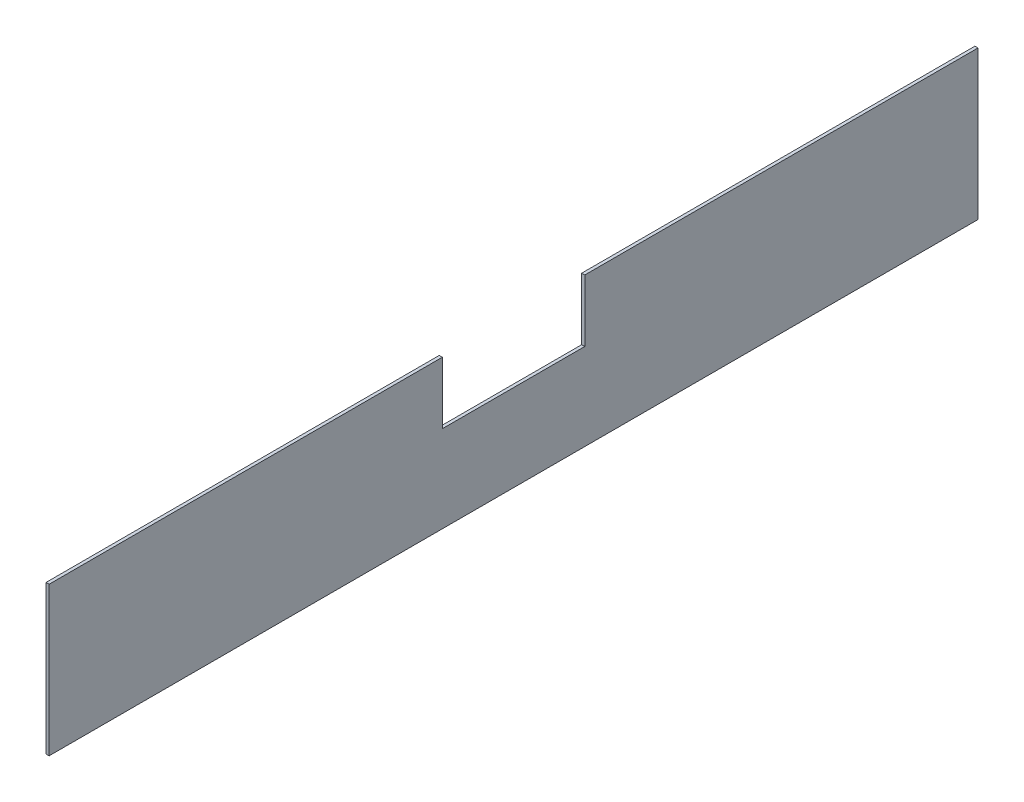
ISO-10303-21;
HEADER;
FILE_DESCRIPTION(('STEP AP214'),'2;1');
FILE_NAME('part.step','',(''),(''),'','','');
FILE_SCHEMA(('AUTOMOTIVE_DESIGN { 1 0 10303 214 1 1 1 1 }'));
ENDSEC;
DATA;
#1=APPLICATION_CONTEXT('core data for automotive mechanical design processes');
#2=APPLICATION_PROTOCOL_DEFINITION('international standard','automotive_design',2000,#1);
#3=PRODUCT_CONTEXT('',#1,'mechanical');
#4=PRODUCT('Part','Part','',(#3));
#5=PRODUCT_RELATED_PRODUCT_CATEGORY('part','',(#4));
#6=PRODUCT_DEFINITION_FORMATION('','',#4);
#7=PRODUCT_DEFINITION_CONTEXT('part definition',#1,'design');
#8=PRODUCT_DEFINITION('design','',#6,#7);
#9=PRODUCT_DEFINITION_SHAPE('','',#8);
#10=(LENGTH_UNIT() NAMED_UNIT(*) SI_UNIT(.MILLI.,.METRE.));
#11=(NAMED_UNIT(*) PLANE_ANGLE_UNIT() SI_UNIT($,.RADIAN.));
#12=(NAMED_UNIT(*) SI_UNIT($,.STERADIAN.) SOLID_ANGLE_UNIT());
#13=UNCERTAINTY_MEASURE_WITH_UNIT(LENGTH_MEASURE(1.E-05),#10,'distance_accuracy_value','');
#14=(GEOMETRIC_REPRESENTATION_CONTEXT(3) GLOBAL_UNCERTAINTY_ASSIGNED_CONTEXT((#13)) GLOBAL_UNIT_ASSIGNED_CONTEXT((#10,
#11,#12)) REPRESENTATION_CONTEXT('',''));
#15=CARTESIAN_POINT('',(0.,0.,0.));
#16=DIRECTION('',(0.,0.,1.));
#17=DIRECTION('',(1.,0.,0.));
#18=AXIS2_PLACEMENT_3D('',#15,#16,#17);
#19=CARTESIAN_POINT('',(-123.984000007025,60.0010000000601,150.000000000024));
#20=DIRECTION('',(-5.91462989710949E-11,1.,0.));
#21=DIRECTION('',(-1.,-5.91462989710949E-11,0.));
#22=AXIS2_PLACEMENT_3D('',#19,#20,#21);
#23=PLANE('',#22);
#24=DIRECTION('',(-1.,-5.9146407453713E-11,-2.36582975430166E-11));
#25=VECTOR('',#24,1.);
#26=CARTESIAN_POINT('',(-113.984000002932,60.0010000006515,-23.0000000026967));
#27=LINE('',#26,#25);
#28=CARTESIAN_POINT('',(-122.984000003476,60.0010000001192,-23.0000000029096));
#29=VERTEX_POINT('',#28);
#30=CARTESIAN_POINT('',(-123.984000002932,60.0010000000601,-23.0000000029332));
#31=VERTEX_POINT('',#30);
#32=EDGE_CURVE('E125',#29,#31,#27,.T.);
#33=ORIENTED_EDGE('',*,*,#32,.F.);
#34=DIRECTION('',(-2.36582975430166E-11,0.,1.));
#35=VECTOR('',#34,1.);
#36=CARTESIAN_POINT('',(-122.984000007025,60.0010000001192,150.000000000048));
#37=LINE('',#36,#35);
#38=CARTESIAN_POINT('',(-122.983999999927,60.0010000001192,-150.00000000291));
#39=VERTEX_POINT('',#38);
#40=EDGE_CURVE('E153',#39,#29,#37,.T.);
#41=ORIENTED_EDGE('',*,*,#40,.F.);
#42=DIRECTION('',(1.,5.91462989710949E-11,2.36582860973123E-11));
#43=VECTOR('',#42,1.);
#44=CARTESIAN_POINT('',(-123.983999999927,60.0010000000601,-150.000000002933));
#45=LINE('',#44,#43);
#46=CARTESIAN_POINT('',(-123.983999999927,60.0010000000601,-150.000000002933));
#47=VERTEX_POINT('',#46);
#48=EDGE_CURVE('E158',#47,#39,#45,.T.);
#49=ORIENTED_EDGE('',*,*,#48,.F.);
#50=DIRECTION('',(-2.36582975430166E-11,0.,1.));
#51=VECTOR('',#50,1.);
#52=CARTESIAN_POINT('',(-123.984000007025,60.0010000000601,150.000000000024));
#53=LINE('',#52,#51);
#54=EDGE_CURVE('E156',#47,#31,#53,.T.);
#55=ORIENTED_EDGE('',*,*,#54,.T.);
#56=EDGE_LOOP('',(#33,#41,#49,#55));
#57=FACE_BOUND('',#56,.T.);
#58=ADVANCED_FACE('F47',(#57),#23,.T.);
#59=CARTESIAN_POINT('',(-123.983999999927,-59.9999999999399,150.000000000024));
#60=DIRECTION('',(-2.36582860973123E-11,0.,1.));
#61=DIRECTION('',(1.,0.,2.36582860973123E-11));
#62=AXIS2_PLACEMENT_3D('',#59,#60,#61);
#63=PLANE('',#62);
#64=DIRECTION('',(1.,5.9146407453713E-11,2.36582975430166E-11));
#65=VECTOR('',#64,1.);
#66=CARTESIAN_POINT('',(-132.984000004186,11.9999999995278,149.999999999811));
#67=LINE('',#66,#65);
#68=CARTESIAN_POINT('',(-123.984000000637,12.0000000000601,150.000000000024));
#69=VERTEX_POINT('',#68);
#70=CARTESIAN_POINT('',(-122.984000004186,12.0000000001192,150.000000000048));
#71=VERTEX_POINT('',#70);
#72=EDGE_CURVE('E142',#69,#71,#67,.T.);
#73=ORIENTED_EDGE('',*,*,#72,.T.);
#74=DIRECTION('',(5.9146407453713E-11,-1.,0.));
#75=VECTOR('',#74,1.);
#76=CARTESIAN_POINT('',(-122.983999999927,-59.9999999998808,150.000000000048));
#77=LINE('',#76,#75);
#78=CARTESIAN_POINT('',(-122.984000007025,60.0010000001192,150.000000000048));
#79=VERTEX_POINT('',#78);
#80=EDGE_CURVE('E148',#79,#71,#77,.T.);
#81=ORIENTED_EDGE('',*,*,#80,.F.);
#82=DIRECTION('',(1.,5.91462989710949E-11,2.36582860973123E-11));
#83=VECTOR('',#82,1.);
#84=CARTESIAN_POINT('',(-123.984000007025,60.0010000000601,150.000000000024));
#85=LINE('',#84,#83);
#86=CARTESIAN_POINT('',(-123.984000007025,60.0010000000601,150.000000000024));
#87=VERTEX_POINT('',#86);
#88=EDGE_CURVE('E166',#87,#79,#85,.T.);
#89=ORIENTED_EDGE('',*,*,#88,.F.);
#90=DIRECTION('',(5.9146407453713E-11,-1.,0.));
#91=VECTOR('',#90,1.);
#92=CARTESIAN_POINT('',(-123.983999999927,-59.9999999999399,150.000000000024));
#93=LINE('',#92,#91);
#94=EDGE_CURVE('E149',#87,#69,#93,.T.);
#95=ORIENTED_EDGE('',*,*,#94,.T.);
#96=EDGE_LOOP('',(#73,#81,#89,#95));
#97=FACE_BOUND('',#96,.T.);
#98=ADVANCED_FACE('F49',(#97),#63,.T.);
#99=DIRECTION('',(-1.,-5.9146407453713E-11,-2.36582975430166E-11));
#100=VECTOR('',#99,1.);
#101=CARTESIAN_POINT('',(-113.98400000402,60.0010000006515,22.9999999973033));
#102=LINE('',#101,#100);
#103=CARTESIAN_POINT('',(-122.984000003429,60.0010000001192,22.9999999970904));
#104=VERTEX_POINT('',#103);
#105=CARTESIAN_POINT('',(-123.98400000402,60.0010000000601,22.9999999970668));
#106=VERTEX_POINT('',#105);
#107=EDGE_CURVE('E137',#104,#106,#102,.T.);
#108=ORIENTED_EDGE('',*,*,#107,.T.);
#109=EDGE_CURVE('E155',#106,#87,#53,.T.);
#110=ORIENTED_EDGE('',*,*,#109,.T.);
#111=ORIENTED_EDGE('',*,*,#88,.T.);
#112=EDGE_CURVE('E163',#104,#79,#37,.T.);
#113=ORIENTED_EDGE('',*,*,#112,.F.);
#114=EDGE_LOOP('',(#108,#110,#111,#113));
#115=FACE_BOUND('',#114,.T.);
#116=ADVANCED_FACE('F177',(#115),#23,.T.);
#117=CARTESIAN_POINT('',(-123.98399999283,-59.9999999999399,-150.000000002933));
#118=DIRECTION('',(2.36582860973123E-11,0.,-1.));
#119=DIRECTION('',(-1.,0.,-2.36582860973123E-11));
#120=AXIS2_PLACEMENT_3D('',#117,#118,#119);
#121=PLANE('',#120);
#122=DIRECTION('',(1.,5.9146407453713E-11,2.36582975430166E-11));
#123=VECTOR('',#122,1.);
#124=CARTESIAN_POINT('',(-132.983999997088,11.9999999995278,-150.000000006103));
#125=LINE('',#124,#123);
#126=CARTESIAN_POINT('',(-123.983999994959,12.0000000000601,-150.000000005891));
#127=VERTEX_POINT('',#126);
#128=CARTESIAN_POINT('',(-122.983999997088,12.0000000001193,-150.00000000291));
#129=VERTEX_POINT('',#128);
#130=EDGE_CURVE('E70',#127,#129,#125,.T.);
#131=ORIENTED_EDGE('',*,*,#130,.F.);
#132=DIRECTION('',(-5.9146291806445E-11,1.,0.));
#133=VECTOR('',#132,1.);
#134=CARTESIAN_POINT('',(-123.98399999283,-59.9999999999399,-150.000000002933));
#135=LINE('',#134,#133);
#136=EDGE_CURVE('E152',#127,#47,#135,.T.);
#137=ORIENTED_EDGE('',*,*,#136,.T.);
#138=ORIENTED_EDGE('',*,*,#48,.T.);
#139=DIRECTION('',(-5.9146291806445E-11,1.,0.));
#140=VECTOR('',#139,1.);
#141=CARTESIAN_POINT('',(-122.98399999283,-59.9999999998808,-150.00000000291));
#142=LINE('',#141,#140);
#143=EDGE_CURVE('E161',#129,#39,#142,.T.);
#144=ORIENTED_EDGE('',*,*,#143,.F.);
#145=EDGE_LOOP('',(#131,#137,#138,#144));
#146=FACE_BOUND('',#145,.T.);
#147=ADVANCED_FACE('F184',(#146),#121,.T.);
#148=CARTESIAN_POINT('',(-123.983999999927,-7.33320807325422E-09,-2.93325035112594E-09));
#149=DIRECTION('',(-1.,-5.9146407453713E-11,-2.36582975430166E-11));
#150=DIRECTION('',(5.9146407453713E-11,-1.,0.));
#151=AXIS2_PLACEMENT_3D('',#148,#149,#150);
#152=PLANE('',#151);
#153=DIRECTION('',(5.91464377256507E-11,-1.,0.));
#154=VECTOR('',#153,1.);
#155=CARTESIAN_POINT('',(-123.984000002932,60.0010000000601,-23.0000000029332));
#156=LINE('',#155,#154);
#157=CARTESIAN_POINT('',(-123.984000001749,40.0009999926669,-23.0000000029332));
#158=VERTEX_POINT('',#157);
#159=EDGE_CURVE('E122',#31,#158,#156,.T.);
#160=ORIENTED_EDGE('',*,*,#159,.F.);
#161=ORIENTED_EDGE('',*,*,#54,.F.);
#162=ORIENTED_EDGE('',*,*,#136,.F.);
#163=DIRECTION('',(2.36582975430166E-11,0.,-1.));
#164=VECTOR('',#163,1.);
#165=CARTESIAN_POINT('',(-123.984000000637,12.0000000000601,-2.93324889397501E-09));
#166=LINE('',#165,#164);
#167=EDGE_CURVE('E145',#69,#127,#166,.T.);
#168=ORIENTED_EDGE('',*,*,#167,.F.);
#169=ORIENTED_EDGE('',*,*,#94,.F.);
#170=ORIENTED_EDGE('',*,*,#109,.F.);
#171=DIRECTION('',(-5.91464377256507E-11,1.,0.));
#172=VECTOR('',#171,1.);
#173=CARTESIAN_POINT('',(-123.98400000402,60.0010000000601,22.9999999970668));
#174=LINE('',#173,#172);
#175=CARTESIAN_POINT('',(-123.984000002837,40.0009999926669,22.9999999970668));
#176=VERTEX_POINT('',#175);
#177=EDGE_CURVE('E119',#176,#106,#174,.T.);
#178=ORIENTED_EDGE('',*,*,#177,.F.);
#179=DIRECTION('',(-2.36583096108913E-11,0.,1.));
#180=VECTOR('',#179,1.);
#181=CARTESIAN_POINT('',(-123.984000001749,40.0009999926669,-23.0000000029332));
#182=LINE('',#181,#180);
#183=EDGE_CURVE('E114',#158,#176,#182,.T.);
#184=ORIENTED_EDGE('',*,*,#183,.F.);
#185=EDGE_LOOP('',(#160,#161,#162,#168,#169,#170,#178,#184));
#186=FACE_BOUND('',#185,.T.);
#187=ADVANCED_FACE('F130',(#186),#152,.T.);
#188=CARTESIAN_POINT('',(-122.983999999927,-7.27406177428312E-09,-2.90959206502862E-09));
#189=DIRECTION('',(-1.,-5.9146407453713E-11,-2.36582975430166E-11));
#190=DIRECTION('',(5.9146407453713E-11,-1.,0.));
#191=AXIS2_PLACEMENT_3D('',#188,#189,#190);
#192=PLANE('',#191);
#193=ORIENTED_EDGE('',*,*,#40,.T.);
#194=DIRECTION('',(5.9146407453713E-11,-1.,0.));
#195=VECTOR('',#194,1.);
#196=CARTESIAN_POINT('',(-122.983999999383,-7.27406177425094E-09,-23.0000000029096));
#197=LINE('',#196,#195);
#198=CARTESIAN_POINT('',(-122.984000002293,40.000999992726,-23.0000000029096));
#199=VERTEX_POINT('',#198);
#200=EDGE_CURVE('E11',#29,#199,#197,.T.);
#201=ORIENTED_EDGE('',*,*,#200,.T.);
#202=DIRECTION('',(-2.36582975430166E-11,0.,1.));
#203=VECTOR('',#202,1.);
#204=CARTESIAN_POINT('',(-122.984000002293,40.000999992726,-2.9095920650846E-09));
#205=LINE('',#204,#203);
#206=CARTESIAN_POINT('',(-122.984000002837,40.000999992726,22.9999999973033));
#207=VERTEX_POINT('',#206);
#208=EDGE_CURVE('E117',#199,#207,#205,.T.);
#209=ORIENTED_EDGE('',*,*,#208,.T.);
#210=DIRECTION('',(-5.9146407453713E-11,1.,0.));
#211=VECTOR('',#210,1.);
#212=CARTESIAN_POINT('',(-122.984000000471,-7.2740617743153E-09,22.9999999970904));
#213=LINE('',#212,#211);
#214=EDGE_CURVE('E55',#207,#104,#213,.T.);
#215=ORIENTED_EDGE('',*,*,#214,.T.);
#216=ORIENTED_EDGE('',*,*,#112,.T.);
#217=ORIENTED_EDGE('',*,*,#80,.T.);
#218=DIRECTION('',(-2.36582975427833E-11,0.,1.));
#219=VECTOR('',#218,1.);
#220=CARTESIAN_POINT('',(-122.984000004186,12.0000000001192,150.000000000048));
#221=LINE('',#220,#219);
#222=EDGE_CURVE('E136',#129,#71,#221,.T.);
#223=ORIENTED_EDGE('',*,*,#222,.F.);
#224=ORIENTED_EDGE('',*,*,#143,.T.);
#225=EDGE_LOOP('',(#193,#201,#209,#215,#216,#217,#223,#224));
#226=FACE_BOUND('',#225,.T.);
#227=ADVANCED_FACE('F174',(#226),#192,.F.);
#228=CARTESIAN_POINT('',(-132.984000004186,11.9999999995278,149.999999999811));
#229=DIRECTION('',(-5.9146407453713E-11,1.,0.));
#230=DIRECTION('',(-1.,-5.9146407453713E-11,0.));
#231=AXIS2_PLACEMENT_3D('',#228,#229,#230);
#232=PLANE('',#231);
#233=ORIENTED_EDGE('',*,*,#167,.T.);
#234=ORIENTED_EDGE('',*,*,#130,.T.);
#235=ORIENTED_EDGE('',*,*,#222,.T.);
#236=ORIENTED_EDGE('',*,*,#72,.F.);
#237=EDGE_LOOP('',(#233,#234,#235,#236));
#238=FACE_BOUND('',#237,.T.);
#239=ADVANCED_FACE('F190',(#238),#232,.F.);
#240=CARTESIAN_POINT('',(-113.984000002932,60.0010000006515,-23.0000000026967));
#241=DIRECTION('',(2.36582975430166E-11,0.,-1.));
#242=DIRECTION('',(-1.,0.,-2.36582975430166E-11));
#243=AXIS2_PLACEMENT_3D('',#240,#241,#242);
#244=PLANE('',#243);
#245=ORIENTED_EDGE('',*,*,#32,.T.);
#246=ORIENTED_EDGE('',*,*,#159,.T.);
#247=DIRECTION('',(-1.,-5.9146407453713E-11,-2.36582975430166E-11));
#248=VECTOR('',#247,1.);
#249=CARTESIAN_POINT('',(-113.984000001749,40.0009999932583,-23.0000000026967));
#250=LINE('',#249,#248);
#251=EDGE_CURVE('E110',#199,#158,#250,.T.);
#252=ORIENTED_EDGE('',*,*,#251,.F.);
#253=ORIENTED_EDGE('',*,*,#200,.F.);
#254=EDGE_LOOP('',(#245,#246,#252,#253));
#255=FACE_BOUND('',#254,.T.);
#256=ADVANCED_FACE('F123',(#255),#244,.F.);
#257=CARTESIAN_POINT('',(-113.98400000402,60.0010000006515,22.9999999973033));
#258=DIRECTION('',(-2.36582975430166E-11,0.,1.));
#259=DIRECTION('',(1.,0.,2.36582975430166E-11));
#260=AXIS2_PLACEMENT_3D('',#257,#258,#259);
#261=PLANE('',#260);
#262=DIRECTION('',(-1.,-5.9146407453713E-11,-2.36582975430166E-11));
#263=VECTOR('',#262,1.);
#264=CARTESIAN_POINT('',(-113.984000002837,40.0009999932583,22.9999999973033));
#265=LINE('',#264,#263);
#266=EDGE_CURVE('E62',#207,#176,#265,.T.);
#267=ORIENTED_EDGE('',*,*,#266,.T.);
#268=ORIENTED_EDGE('',*,*,#177,.T.);
#269=ORIENTED_EDGE('',*,*,#107,.F.);
#270=ORIENTED_EDGE('',*,*,#214,.F.);
#271=EDGE_LOOP('',(#267,#268,#269,#270));
#272=FACE_BOUND('',#271,.T.);
#273=ADVANCED_FACE('F196',(#272),#261,.F.);
#274=CARTESIAN_POINT('',(-113.984000001749,40.0009999932583,-23.0000000026967));
#275=DIRECTION('',(5.9146407453713E-11,-1.,0.));
#276=DIRECTION('',(1.,5.9146407453713E-11,0.));
#277=AXIS2_PLACEMENT_3D('',#274,#275,#276);
#278=PLANE('',#277);
#279=ORIENTED_EDGE('',*,*,#251,.T.);
#280=ORIENTED_EDGE('',*,*,#183,.T.);
#281=ORIENTED_EDGE('',*,*,#266,.F.);
#282=ORIENTED_EDGE('',*,*,#208,.F.);
#283=EDGE_LOOP('',(#279,#280,#281,#282));
#284=FACE_BOUND('',#283,.T.);
#285=ADVANCED_FACE('F112',(#284),#278,.F.);
#286=CLOSED_SHELL('',(#58,#98,#116,#147,#187,#227,#239,#256,#273,#285));
#287=MANIFOLD_SOLID_BREP('B2',#286);
#288=ADVANCED_BREP_SHAPE_REPRESENTATION('',(#18,#287),#14);
#289=SHAPE_DEFINITION_REPRESENTATION(#9,#288);
ENDSEC;
END-ISO-10303-21;
